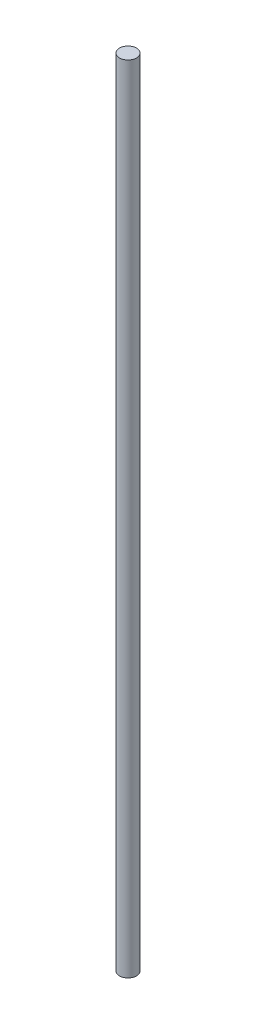
ISO-10303-21;
HEADER;
FILE_DESCRIPTION(('STEP AP214'),'2;1');
FILE_NAME('part.step','',(''),(''),'','','');
FILE_SCHEMA(('AUTOMOTIVE_DESIGN { 1 0 10303 214 1 1 1 1 }'));
ENDSEC;
DATA;
#1=APPLICATION_CONTEXT('core data for automotive mechanical design processes');
#2=APPLICATION_PROTOCOL_DEFINITION('international standard','automotive_design',2000,#1);
#3=PRODUCT_CONTEXT('',#1,'mechanical');
#4=PRODUCT('Part','Part','',(#3));
#5=PRODUCT_RELATED_PRODUCT_CATEGORY('part','',(#4));
#6=PRODUCT_DEFINITION_FORMATION('','',#4);
#7=PRODUCT_DEFINITION_CONTEXT('part definition',#1,'design');
#8=PRODUCT_DEFINITION('design','',#6,#7);
#9=PRODUCT_DEFINITION_SHAPE('','',#8);
#10=(LENGTH_UNIT() NAMED_UNIT(*) SI_UNIT(.MILLI.,.METRE.));
#11=(NAMED_UNIT(*) PLANE_ANGLE_UNIT() SI_UNIT($,.RADIAN.));
#12=(NAMED_UNIT(*) SI_UNIT($,.STERADIAN.) SOLID_ANGLE_UNIT());
#13=UNCERTAINTY_MEASURE_WITH_UNIT(LENGTH_MEASURE(1.E-05),#10,'distance_accuracy_value','');
#14=(GEOMETRIC_REPRESENTATION_CONTEXT(3) GLOBAL_UNCERTAINTY_ASSIGNED_CONTEXT((#13)) GLOBAL_UNIT_ASSIGNED_CONTEXT((#10,
#11,#12)) REPRESENTATION_CONTEXT('',''));
#15=CARTESIAN_POINT('',(0.,0.,0.));
#16=DIRECTION('',(0.,0.,1.));
#17=DIRECTION('',(1.,0.,0.));
#18=AXIS2_PLACEMENT_3D('',#15,#16,#17);
#19=CARTESIAN_POINT('',(0.,139.,0.));
#20=DIRECTION('',(0.,-1.,0.));
#21=DIRECTION('',(0.,0.,-1.));
#22=AXIS2_PLACEMENT_3D('',#19,#20,#21);
#23=CYLINDRICAL_SURFACE('',#22,1.5);
#24=CARTESIAN_POINT('',(0.,139.,0.));
#25=DIRECTION('',(0.,1.,0.));
#26=DIRECTION('',(0.,0.,1.));
#27=AXIS2_PLACEMENT_3D('',#24,#25,#26);
#28=CIRCLE('',#27,1.5);
#29=CARTESIAN_POINT('',(0.,139.,1.5));
#30=VERTEX_POINT('',#29);
#31=EDGE_CURVE('E10',#30,#30,#28,.T.);
#32=ORIENTED_EDGE('',*,*,#31,.F.);
#33=EDGE_LOOP('',(#32));
#34=FACE_BOUND('',#33,.T.);
#35=CARTESIAN_POINT('',(0.,0.,0.));
#36=DIRECTION('',(0.,1.,0.));
#37=DIRECTION('',(0.,0.,1.));
#38=AXIS2_PLACEMENT_3D('',#35,#36,#37);
#39=CIRCLE('',#38,1.5);
#40=CARTESIAN_POINT('',(0.,0.,1.5));
#41=VERTEX_POINT('',#40);
#42=EDGE_CURVE('E40',#41,#41,#39,.T.);
#43=ORIENTED_EDGE('',*,*,#42,.T.);
#44=EDGE_LOOP('',(#43));
#45=FACE_BOUND('',#44,.T.);
#46=ADVANCED_FACE('F37',(#34,#45),#23,.T.);
#47=CARTESIAN_POINT('',(0.,139.,0.));
#48=DIRECTION('',(0.,1.,0.));
#49=DIRECTION('',(0.,0.,1.));
#50=AXIS2_PLACEMENT_3D('',#47,#48,#49);
#51=PLANE('',#50);
#52=ORIENTED_EDGE('',*,*,#31,.T.);
#53=EDGE_LOOP('',(#52));
#54=FACE_BOUND('',#53,.T.);
#55=ADVANCED_FACE('F52',(#54),#51,.T.);
#56=CARTESIAN_POINT('',(0.,0.,0.));
#57=DIRECTION('',(0.,1.,0.));
#58=DIRECTION('',(0.,0.,1.));
#59=AXIS2_PLACEMENT_3D('',#56,#57,#58);
#60=PLANE('',#59);
#61=ORIENTED_EDGE('',*,*,#42,.F.);
#62=EDGE_LOOP('',(#61));
#63=FACE_BOUND('',#62,.T.);
#64=ADVANCED_FACE('F50',(#63),#60,.F.);
#65=CLOSED_SHELL('',(#46,#55,#64));
#66=MANIFOLD_SOLID_BREP('B2',#65);
#67=ADVANCED_BREP_SHAPE_REPRESENTATION('',(#18,#66),#14);
#68=SHAPE_DEFINITION_REPRESENTATION(#9,#67);
ENDSEC;
END-ISO-10303-21;
